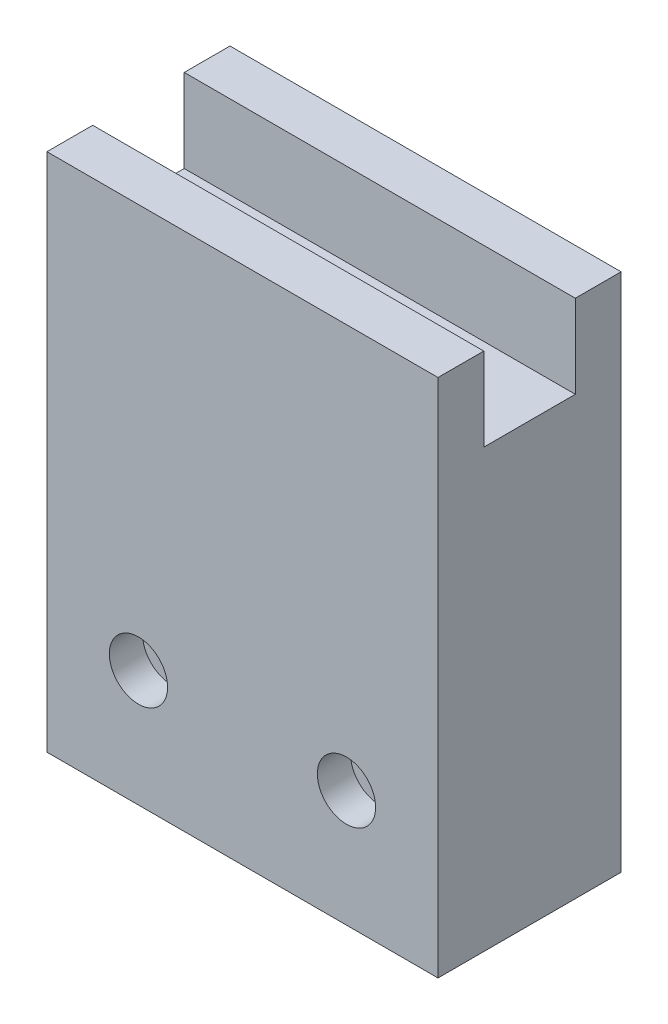
ISO-10303-21;
HEADER;
FILE_DESCRIPTION(('STEP AP214'),'2;1');
FILE_NAME('part.step','',(''),(''),'','','');
FILE_SCHEMA(('AUTOMOTIVE_DESIGN { 1 0 10303 214 1 1 1 1 }'));
ENDSEC;
DATA;
#1=APPLICATION_CONTEXT('core data for automotive mechanical design processes');
#2=APPLICATION_PROTOCOL_DEFINITION('international standard','automotive_design',2000,#1);
#3=PRODUCT_CONTEXT('',#1,'mechanical');
#4=PRODUCT('Part','Part','',(#3));
#5=PRODUCT_RELATED_PRODUCT_CATEGORY('part','',(#4));
#6=PRODUCT_DEFINITION_FORMATION('','',#4);
#7=PRODUCT_DEFINITION_CONTEXT('part definition',#1,'design');
#8=PRODUCT_DEFINITION('design','',#6,#7);
#9=PRODUCT_DEFINITION_SHAPE('','',#8);
#10=(LENGTH_UNIT() NAMED_UNIT(*) SI_UNIT(.MILLI.,.METRE.));
#11=(NAMED_UNIT(*) PLANE_ANGLE_UNIT() SI_UNIT($,.RADIAN.));
#12=(NAMED_UNIT(*) SI_UNIT($,.STERADIAN.) SOLID_ANGLE_UNIT());
#13=UNCERTAINTY_MEASURE_WITH_UNIT(LENGTH_MEASURE(1.E-05),#10,'distance_accuracy_value','');
#14=(GEOMETRIC_REPRESENTATION_CONTEXT(3) GLOBAL_UNCERTAINTY_ASSIGNED_CONTEXT((#13)) GLOBAL_UNIT_ASSIGNED_CONTEXT((#10,
#11,#12)) REPRESENTATION_CONTEXT('',''));
#15=CARTESIAN_POINT('',(0.,0.,0.));
#16=DIRECTION('',(0.,0.,1.));
#17=DIRECTION('',(1.,0.,0.));
#18=AXIS2_PLACEMENT_3D('',#15,#16,#17);
#19=CARTESIAN_POINT('',(0.,0.,22.));
#20=DIRECTION('',(0.,1.,0.));
#21=DIRECTION('',(-1.,0.,0.));
#22=AXIS2_PLACEMENT_3D('',#19,#20,#21);
#23=PLANE('',#22);
#24=CARTESIAN_POINT('',(-36.,0.,11.));
#25=DIRECTION('',(0.,-1.,0.));
#26=DIRECTION('',(1.,0.,0.));
#27=AXIS2_PLACEMENT_3D('',#24,#25,#26);
#28=CIRCLE('',#27,2.5);
#29=CARTESIAN_POINT('',(-33.5,0.,11.));
#30=VERTEX_POINT('',#29);
#31=EDGE_CURVE('E510',#30,#30,#28,.T.);
#32=ORIENTED_EDGE('',*,*,#31,.F.);
#33=EDGE_LOOP('',(#32));
#34=FACE_BOUND('',#33,.T.);
#35=DIRECTION('',(1.,0.,0.));
#36=VECTOR('',#35,1.);
#37=CARTESIAN_POINT('',(0.,0.,0.));
#38=LINE('',#37,#36);
#39=CARTESIAN_POINT('',(-47.,0.,0.));
#40=VERTEX_POINT('',#39);
#41=CARTESIAN_POINT('',(0.,0.,0.));
#42=VERTEX_POINT('',#41);
#43=EDGE_CURVE('E101',#40,#42,#38,.T.);
#44=ORIENTED_EDGE('',*,*,#43,.T.);
#45=DIRECTION('',(0.,0.,-1.));
#46=VECTOR('',#45,1.);
#47=CARTESIAN_POINT('',(0.,0.,22.));
#48=LINE('',#47,#46);
#49=CARTESIAN_POINT('',(0.,0.,22.));
#50=VERTEX_POINT('',#49);
#51=EDGE_CURVE('E195',#50,#42,#48,.T.);
#52=ORIENTED_EDGE('',*,*,#51,.F.);
#53=DIRECTION('',(1.,0.,0.));
#54=VECTOR('',#53,1.);
#55=CARTESIAN_POINT('',(0.,0.,22.));
#56=LINE('',#55,#54);
#57=CARTESIAN_POINT('',(-47.,0.,22.));
#58=VERTEX_POINT('',#57);
#59=EDGE_CURVE('E80',#58,#50,#56,.T.);
#60=ORIENTED_EDGE('',*,*,#59,.F.);
#61=DIRECTION('',(0.,0.,-1.));
#62=VECTOR('',#61,1.);
#63=CARTESIAN_POINT('',(-47.,0.,22.));
#64=LINE('',#63,#62);
#65=EDGE_CURVE('E157',#58,#40,#64,.T.);
#66=ORIENTED_EDGE('',*,*,#65,.T.);
#67=EDGE_LOOP('',(#44,#52,#60,#66));
#68=FACE_BOUND('',#67,.T.);
#69=CARTESIAN_POINT('',(-11.,0.,11.));
#70=DIRECTION('',(0.,-1.,0.));
#71=DIRECTION('',(1.,0.,0.));
#72=AXIS2_PLACEMENT_3D('',#69,#70,#71);
#73=CIRCLE('',#72,2.5);
#74=CARTESIAN_POINT('',(-8.5,0.,11.));
#75=VERTEX_POINT('',#74);
#76=EDGE_CURVE('E357',#75,#75,#73,.F.);
#77=ORIENTED_EDGE('',*,*,#76,.T.);
#78=EDGE_LOOP('',(#77));
#79=FACE_BOUND('',#78,.T.);
#80=ADVANCED_FACE('F49',(#34,#68,#79),#23,.F.);
#81=CARTESIAN_POINT('',(-11.,13.,11.));
#82=DIRECTION('',(0.,-1.,0.));
#83=DIRECTION('',(0.,0.,-1.));
#84=AXIS2_PLACEMENT_3D('',#81,#82,#83);
#85=CYLINDRICAL_SURFACE('',#84,1.5);
#86=CARTESIAN_POINT('',(-11.,12.,9.5));
#87=CARTESIAN_POINT('',(-10.9267792641588,12.0000045980361,9.50000479201202));
#88=CARTESIAN_POINT('',(-10.8534389379785,12.0040635447373,9.5054050243745));
#89=CARTESIAN_POINT('',(-10.7090636037135,12.0199339271892,9.52666706341016));
#90=CARTESIAN_POINT('',(-10.638034863771,12.0317648532015,9.54255517165006));
#91=CARTESIAN_POINT('',(-10.5007653733688,12.0620432504394,9.58371290928377));
#92=CARTESIAN_POINT('',(-10.4344983845963,12.0804504806799,9.60892551356918));
#93=CARTESIAN_POINT('',(-10.3075776644792,12.1224944327831,9.66754234418723));
#94=CARTESIAN_POINT('',(-10.2469222982037,12.1461296246452,9.70094417419352));
#95=CARTESIAN_POINT('',(-10.1265340624099,12.1995045545602,9.77826301159083));
#96=CARTESIAN_POINT('',(-10.067406770728,12.2296069145156,9.82286732933408));
#97=CARTESIAN_POINT('',(-9.95697283232329,12.2923298211662,9.91949583736117));
#98=CARTESIAN_POINT('',(-9.90567851727774,12.3249542192139,9.97153148279983));
#99=CARTESIAN_POINT('',(-9.80162838563377,12.3972887634801,10.0935829532784));
#100=CARTESIAN_POINT('',(-9.75069421578796,12.4370914513536,10.1651036771217));
#101=CARTESIAN_POINT('',(-9.66138001823652,12.5128855533586,10.3174510123665));
#102=CARTESIAN_POINT('',(-9.62298283016923,12.5488821311632,10.3982646970003));
#103=CARTESIAN_POINT('',(-9.57119372188212,12.6002284481982,10.5395028386762));
#104=CARTESIAN_POINT('',(-9.55374325543461,12.6184224881327,10.5973906971284));
#105=CARTESIAN_POINT('',(-9.52579327435156,12.6482840584931,10.7163927347849));
#106=CARTESIAN_POINT('',(-9.51527784644733,12.6599665208917,10.7774991778748));
#107=CARTESIAN_POINT('',(-9.50187177858555,12.6749624031545,10.9021825855308));
#108=CARTESIAN_POINT('',(-9.49905045145793,12.678199733234,10.9657768067241));
#109=CARTESIAN_POINT('',(-9.50151786758131,12.6754046822393,11.0926149108816));
#110=CARTESIAN_POINT('',(-9.50680951842651,12.6693689778189,11.1558586600874));
#111=CARTESIAN_POINT('',(-9.52402260708118,12.6503237673748,11.2731913474258));
#112=CARTESIAN_POINT('',(-9.53517513619183,12.6381284294013,11.3275363710462));
#113=CARTESIAN_POINT('',(-9.56294328879267,12.6088580715506,11.4334388787209));
#114=CARTESIAN_POINT('',(-9.57956416318828,12.5917783635923,11.4849936278236));
#115=CARTESIAN_POINT('',(-9.62966935827465,12.5425823070569,11.6162563866342));
#116=CARTESIAN_POINT('',(-9.6671985150602,12.5077435086077,11.6934004166435));
#117=CARTESIAN_POINT('',(-9.75381976685481,12.434667018548,11.8391965238691));
#118=CARTESIAN_POINT('',(-9.80293995744122,12.3964212111389,11.9078273392547));
#119=CARTESIAN_POINT('',(-9.91348395897865,12.3194832768686,12.0377533904037));
#120=CARTESIAN_POINT('',(-9.97518624473964,12.2808041326976,12.0988206068815));
#121=CARTESIAN_POINT('',(-10.1095774782904,12.2075196201903,12.2102636467812));
#122=CARTESIAN_POINT('',(-10.1822449457062,12.1729065173624,12.2606599202304));
#123=CARTESIAN_POINT('',(-10.3220979195459,12.1172027392636,12.3399807992403));
#124=CARTESIAN_POINT('',(-10.3874601298144,12.0947922905499,12.3711845942158));
#125=CARTESIAN_POINT('',(-10.5236478267979,12.0562709558305,12.4242248804639));
#126=CARTESIAN_POINT('',(-10.5944698589362,12.0401561249565,12.4460672384993));
#127=CARTESIAN_POINT('',(-10.7403237675165,12.0155441136401,12.4792533628864));
#128=CARTESIAN_POINT('',(-10.8153787185941,12.0070940702825,12.4905321789386));
#129=CARTESIAN_POINT('',(-10.9667987602031,11.9988411634056,12.5015495973717));
#130=CARTESIAN_POINT('',(-11.0431632843727,11.9990346515459,12.5012930686954));
#131=CARTESIAN_POINT('',(-11.1868042173296,12.0075745282413,12.4898891307268));
#132=CARTESIAN_POINT('',(-11.2542223275461,12.015099133996,12.4798394631113));
#133=CARTESIAN_POINT('',(-11.3861106706091,12.0364867979841,12.4510262199921));
#134=CARTESIAN_POINT('',(-11.4505802729873,12.0503512049274,12.4322607903106));
#135=CARTESIAN_POINT('',(-11.5774167796898,12.0840016931669,12.3861124694069));
#136=CARTESIAN_POINT('',(-11.6396291725361,12.1039794970981,12.3584488185726));
#137=CARTESIAN_POINT('',(-11.7585185270431,12.1483301458804,12.2958275445744));
#138=CARTESIAN_POINT('',(-11.8151947213364,12.1727035986793,12.2608689123603));
#139=CARTESIAN_POINT('',(-11.931511626319,12.228808531135,12.1782167535894));
#140=CARTESIAN_POINT('',(-11.9900667626987,12.2610890497496,12.1293714605626));
#141=CARTESIAN_POINT('',(-12.0987197485585,12.3276104712522,12.0239912474116));
#142=CARTESIAN_POINT('',(-12.1487983046958,12.3618556149261,11.9674393003066));
#143=CARTESIAN_POINT('',(-12.2487754107563,12.436308717085,11.8358501190388));
#144=CARTESIAN_POINT('',(-12.296830436487,12.476412814799,11.7593424385077));
#145=CARTESIAN_POINT('',(-12.3792323599828,12.5505940865155,11.5966399220276));
#146=CARTESIAN_POINT('',(-12.4136200051552,12.5846890042903,11.5104748780914));
#147=CARTESIAN_POINT('',(-12.4561573425677,12.6288112219142,11.3645855511255));
#148=CARTESIAN_POINT('',(-12.46931009513,12.6430418817544,11.3076088735976));
#149=CARTESIAN_POINT('',(-12.4889152218191,12.6645794389699,11.1912929530168));
#150=CARTESIAN_POINT('',(-12.4953825519924,12.6719017877977,11.1319592931978));
#151=CARTESIAN_POINT('',(-12.5011532020906,12.6784239820779,11.0121709201887));
#152=CARTESIAN_POINT('',(-12.5004201532526,12.6775825931503,10.9517120569904));
#153=CARTESIAN_POINT('',(-12.4917688383822,12.6678355145633,10.8319431612478));
#154=CARTESIAN_POINT('',(-12.4838413002458,12.6589194184252,10.7726347121028));
#155=CARTESIAN_POINT('',(-12.4589384181972,12.6318265120223,10.6440854285892));
#156=CARTESIAN_POINT('',(-12.4403656795411,12.6120529404936,10.5755028198672));
#157=CARTESIAN_POINT('',(-12.3946962726612,12.5661703661459,10.4434651511695));
#158=CARTESIAN_POINT('',(-12.3675780729773,12.5400453985307,10.3800235579618));
#159=CARTESIAN_POINT('',(-12.2949891893364,12.4748352267118,10.2374793695137));
#160=CARTESIAN_POINT('',(-12.2464154206597,12.434397968089,10.1605784172443));
#161=CARTESIAN_POINT('',(-12.1365071846594,12.3528648981873,10.0168739550224));
#162=CARTESIAN_POINT('',(-12.0751613475858,12.3117685304578,9.95007953405516));
#163=CARTESIAN_POINT('',(-11.9396271449379,12.2327101106021,9.82716815771668));
#164=CARTESIAN_POINT('',(-11.8653371615629,12.1947766628893,9.77114368062282));
#165=CARTESIAN_POINT('',(-11.7051590989362,12.126427103319,9.67277694885466));
#166=CARTESIAN_POINT('',(-11.6192994204018,12.0959930840704,9.6304020254275));
#167=CARTESIAN_POINT('',(-11.4648402903565,12.0536329537595,9.5722005790143));
#168=CARTESIAN_POINT('',(-11.3985536147747,12.0388967750028,9.55223326862383));
#169=CARTESIAN_POINT('',(-11.2628416103928,12.0161626002976,9.52158209738851));
#170=CARTESIAN_POINT('',(-11.1934256238349,12.0081457878911,9.51087230975004));
#171=CARTESIAN_POINT('',(-11.1029633098619,12.0025452829369,9.50339530578565));
#172=CARTESIAN_POINT('',(-11.0824069459941,12.0015923856792,9.50212372251059));
#173=CARTESIAN_POINT('',(-11.0412368896244,12.0003190457686,9.50042532676903));
#174=CARTESIAN_POINT('',(-11.0206231884284,11.9999987049275,9.49999865029263));
#175=CARTESIAN_POINT('',(-11.,12.,9.5));
#176=B_SPLINE_CURVE_WITH_KNOTS('',3,(#86,#87,#88,#89,#90,#91,#92,#93,#94,#95,#96,#97,#98,#99,
#100,#101,#102,#103,#104,#105,#106,#107,#108,#109,#110,#111,#112,#113,#114,#115,#116,#117,#118,
#119,#120,#121,#122,#123,#124,#125,#126,#127,#128,#129,#130,#131,#132,#133,#134,#135,#136,#137,
#138,#139,#140,#141,#142,#143,#144,#145,#146,#147,#148,#149,#150,#151,#152,#153,#154,#155,#156,
#157,#158,#159,#160,#161,#162,#163,#164,#165,#166,#167,#168,#169,#170,#171,#172,#173,#174,#175),
.UNSPECIFIED.,.T.,.F.,(4,2,2,2,2,2,2,2,2,2,2,2,2,2,2,2,2,2,2,2,2,2,2,2,2,2,2,2,2,2,2,2,2,2,2,2,
2,2,2,2,2,2,2,2,4),(0.,0.219571786572042,0.439696319423243,0.65849633357338,0.877232398849292,
1.1162243131743,1.35558868405162,1.64360015887451,1.93121574056506,2.11999518529901,
2.3083399319529,2.49837587621257,2.6884799430021,2.85826890162709,3.0282213760064,
3.3044933180591,3.58144192357889,3.8653588393809,4.14872662493691,4.37526505006389,
4.60166129643117,4.82944058166899,5.05712372466613,5.26191187011994,5.46674360185812,
5.67880439483679,5.89089453977541,6.13840382081868,6.38646908985452,6.68168596015947,
6.97601595850112,7.15589161422933,7.33536399114208,7.51574333854741,7.69635548563854,
7.91639670960134,8.13699685139921,8.43412246655767,8.73151372390892,9.03135449492649,
9.33047220273163,9.54195697541629,9.75284752283256,9.81468166878711,9.87652576630966),.UNSPECIFIED.);
#177=CARTESIAN_POINT('',(-11.,12.,9.5));
#178=VERTEX_POINT('',#177);
#179=EDGE_CURVE('E53',#178,#178,#176,.T.);
#180=ORIENTED_EDGE('',*,*,#179,.F.);
#181=EDGE_LOOP('',(#180));
#182=FACE_BOUND('',#181,.T.);
#183=CARTESIAN_POINT('',(-11.,4.,11.));
#184=DIRECTION('',(0.,-1.,0.));
#185=DIRECTION('',(1.,0.,0.));
#186=AXIS2_PLACEMENT_3D('',#183,#184,#185);
#187=CIRCLE('',#186,1.5);
#188=CARTESIAN_POINT('',(-9.5,4.,11.));
#189=VERTEX_POINT('',#188);
#190=EDGE_CURVE('E515',#189,#189,#187,.F.);
#191=ORIENTED_EDGE('',*,*,#190,.F.);
#192=EDGE_LOOP('',(#191));
#193=FACE_BOUND('',#192,.T.);
#194=ADVANCED_FACE('F236',(#182,#193),#85,.F.);
#195=CARTESIAN_POINT('',(-36.,13.,11.));
#196=DIRECTION('',(0.,-1.,0.));
#197=DIRECTION('',(0.,0.,-1.));
#198=AXIS2_PLACEMENT_3D('',#195,#196,#197);
#199=CYLINDRICAL_SURFACE('',#198,1.5);
#200=CARTESIAN_POINT('',(-36.,12.,9.49999999999999));
#201=CARTESIAN_POINT('',(-35.9267792641589,12.000004598036,9.50000479201202));
#202=CARTESIAN_POINT('',(-35.8534389379785,12.0040635447373,9.50540502437449));
#203=CARTESIAN_POINT('',(-35.7090636037135,12.0199339271892,9.52666706341016));
#204=CARTESIAN_POINT('',(-35.638034863771,12.0317648532015,9.54255517165005));
#205=CARTESIAN_POINT('',(-35.5007653733688,12.0620432504394,9.58371290928377));
#206=CARTESIAN_POINT('',(-35.4344983845963,12.0804504806799,9.60892551356917));
#207=CARTESIAN_POINT('',(-35.3075776644792,12.1224944327831,9.66754234418723));
#208=CARTESIAN_POINT('',(-35.2469222982037,12.1461296246452,9.70094417419351));
#209=CARTESIAN_POINT('',(-35.1265340624099,12.1995045545602,9.77826301159082));
#210=CARTESIAN_POINT('',(-35.067406770728,12.2296069145156,9.82286732933407));
#211=CARTESIAN_POINT('',(-34.9569728323233,12.2923298211662,9.91949583736117));
#212=CARTESIAN_POINT('',(-34.9056785172777,12.3249542192139,9.97153148279983));
#213=CARTESIAN_POINT('',(-34.8016283856338,12.3972887634801,10.0935829532784));
#214=CARTESIAN_POINT('',(-34.750694215788,12.4370914513536,10.1651036771217));
#215=CARTESIAN_POINT('',(-34.6613800182365,12.5128855533586,10.3174510123665));
#216=CARTESIAN_POINT('',(-34.6229828301692,12.5488821311632,10.3982646970003));
#217=CARTESIAN_POINT('',(-34.5711937218821,12.6002284481982,10.5395028386762));
#218=CARTESIAN_POINT('',(-34.5537432554346,12.6184224881327,10.5973906971284));
#219=CARTESIAN_POINT('',(-34.5257932743516,12.6482840584931,10.7163927347849));
#220=CARTESIAN_POINT('',(-34.5152778464473,12.6599665208917,10.7774991778748));
#221=CARTESIAN_POINT('',(-34.5018717785855,12.6749624031545,10.9021825855308));
#222=CARTESIAN_POINT('',(-34.4990504514579,12.678199733234,10.9657768067241));
#223=CARTESIAN_POINT('',(-34.5015178675813,12.6754046822393,11.0926149108816));
#224=CARTESIAN_POINT('',(-34.5068095184265,12.6693689778189,11.1558586600874));
#225=CARTESIAN_POINT('',(-34.5240226070812,12.6503237673748,11.2731913474258));
#226=CARTESIAN_POINT('',(-34.5351751361918,12.6381284294013,11.3275363710462));
#227=CARTESIAN_POINT('',(-34.5629432887927,12.6088580715506,11.4334388787209));
#228=CARTESIAN_POINT('',(-34.5795641631883,12.5917783635923,11.4849936278236));
#229=CARTESIAN_POINT('',(-34.6296693582747,12.5425823070569,11.6162563866342));
#230=CARTESIAN_POINT('',(-34.6671985150602,12.5077435086077,11.6934004166435));
#231=CARTESIAN_POINT('',(-34.7538197668548,12.434667018548,11.8391965238691));
#232=CARTESIAN_POINT('',(-34.8029399574412,12.3964212111389,11.9078273392547));
#233=CARTESIAN_POINT('',(-34.9134839589787,12.3194832768685,12.0377533904037));
#234=CARTESIAN_POINT('',(-34.9751862447396,12.2808041326976,12.0988206068815));
#235=CARTESIAN_POINT('',(-35.1095774782904,12.2075196201903,12.2102636467812));
#236=CARTESIAN_POINT('',(-35.1822449457063,12.1729065173624,12.2606599202304));
#237=CARTESIAN_POINT('',(-35.3220979195459,12.1172027392636,12.3399807992403));
#238=CARTESIAN_POINT('',(-35.3874601298144,12.0947922905499,12.3711845942158));
#239=CARTESIAN_POINT('',(-35.5236478267979,12.0562709558305,12.4242248804639));
#240=CARTESIAN_POINT('',(-35.5944698589362,12.0401561249565,12.4460672384993));
#241=CARTESIAN_POINT('',(-35.7403237675165,12.0155441136401,12.4792533628864));
#242=CARTESIAN_POINT('',(-35.8153787185941,12.0070940702825,12.4905321789386));
#243=CARTESIAN_POINT('',(-35.9667987602031,11.9988411634056,12.5015495973717));
#244=CARTESIAN_POINT('',(-36.0431632843727,11.9990346515459,12.5012930686954));
#245=CARTESIAN_POINT('',(-36.1868042173296,12.0075745282413,12.4898891307268));
#246=CARTESIAN_POINT('',(-36.2542223275461,12.015099133996,12.4798394631113));
#247=CARTESIAN_POINT('',(-36.3861106706091,12.0364867979841,12.4510262199921));
#248=CARTESIAN_POINT('',(-36.4505802729873,12.0503512049274,12.4322607903106));
#249=CARTESIAN_POINT('',(-36.5774167796898,12.0840016931669,12.3861124694069));
#250=CARTESIAN_POINT('',(-36.6396291725361,12.1039794970981,12.3584488185726));
#251=CARTESIAN_POINT('',(-36.7585185270431,12.1483301458804,12.2958275445744));
#252=CARTESIAN_POINT('',(-36.8151947213364,12.1727035986793,12.2608689123603));
#253=CARTESIAN_POINT('',(-36.931511626319,12.228808531135,12.1782167535894));
#254=CARTESIAN_POINT('',(-36.9900667626987,12.2610890497496,12.1293714605625));
#255=CARTESIAN_POINT('',(-37.0987197485586,12.3276104712522,12.0239912474116));
#256=CARTESIAN_POINT('',(-37.1487983046958,12.3618556149261,11.9674393003066));
#257=CARTESIAN_POINT('',(-37.2487754107563,12.436308717085,11.8358501190388));
#258=CARTESIAN_POINT('',(-37.2968304364871,12.476412814799,11.7593424385077));
#259=CARTESIAN_POINT('',(-37.3792323599828,12.5505940865155,11.5966399220275));
#260=CARTESIAN_POINT('',(-37.4136200051552,12.5846890042903,11.5104748780914));
#261=CARTESIAN_POINT('',(-37.4561573425677,12.6288112219142,11.3645855511255));
#262=CARTESIAN_POINT('',(-37.46931009513,12.6430418817544,11.3076088735976));
#263=CARTESIAN_POINT('',(-37.4889152218191,12.6645794389699,11.1912929530168));
#264=CARTESIAN_POINT('',(-37.4953825519924,12.6719017877977,11.1319592931977));
#265=CARTESIAN_POINT('',(-37.5011532020906,12.6784239820779,11.0121709201887));
#266=CARTESIAN_POINT('',(-37.5004201532526,12.6775825931503,10.9517120569904));
#267=CARTESIAN_POINT('',(-37.4917688383822,12.6678355145633,10.8319431612478));
#268=CARTESIAN_POINT('',(-37.4838413002458,12.6589194184252,10.7726347121027));
#269=CARTESIAN_POINT('',(-37.4589384181972,12.6318265120223,10.6440854285892));
#270=CARTESIAN_POINT('',(-37.4403656795411,12.6120529404936,10.5755028198672));
#271=CARTESIAN_POINT('',(-37.3946962726612,12.5661703661459,10.4434651511695));
#272=CARTESIAN_POINT('',(-37.3675780729773,12.5400453985307,10.3800235579618));
#273=CARTESIAN_POINT('',(-37.2949891893364,12.4748352267118,10.2374793695137));
#274=CARTESIAN_POINT('',(-37.2464154206597,12.434397968089,10.1605784172442));
#275=CARTESIAN_POINT('',(-37.1365071846594,12.3528648981873,10.0168739550224));
#276=CARTESIAN_POINT('',(-37.0751613475858,12.3117685304578,9.95007953405514));
#277=CARTESIAN_POINT('',(-36.9396271449379,12.2327101106021,9.82716815771666));
#278=CARTESIAN_POINT('',(-36.8653371615629,12.1947766628893,9.7711436806228));
#279=CARTESIAN_POINT('',(-36.7051590989362,12.126427103319,9.67277694885464));
#280=CARTESIAN_POINT('',(-36.6192994204018,12.0959930840704,9.63040202542749));
#281=CARTESIAN_POINT('',(-36.4648402903564,12.0536329537595,9.57220057901429));
#282=CARTESIAN_POINT('',(-36.3985536147747,12.0388967750028,9.55223326862382));
#283=CARTESIAN_POINT('',(-36.2628416103927,12.0161626002976,9.5215820973885));
#284=CARTESIAN_POINT('',(-36.1934256238349,12.0081457878911,9.51087230975003));
#285=CARTESIAN_POINT('',(-36.1029633098619,12.0025452829369,9.50339530578565));
#286=CARTESIAN_POINT('',(-36.0824069459941,12.0015923856792,9.50212372251058));
#287=CARTESIAN_POINT('',(-36.0412368896244,12.0003190457686,9.50042532676902));
#288=CARTESIAN_POINT('',(-36.0206231884284,11.9999987049275,9.49999865029262));
#289=CARTESIAN_POINT('',(-36.,12.,9.49999999999999));
#290=B_SPLINE_CURVE_WITH_KNOTS('',3,(#200,#201,#202,#203,#204,#205,#206,#207,#208,#209,#210,
#211,#212,#213,#214,#215,#216,#217,#218,#219,#220,#221,#222,#223,#224,#225,#226,#227,#228,#229,
#230,#231,#232,#233,#234,#235,#236,#237,#238,#239,#240,#241,#242,#243,#244,#245,#246,#247,#248,
#249,#250,#251,#252,#253,#254,#255,#256,#257,#258,#259,#260,#261,#262,#263,#264,#265,#266,#267,
#268,#269,#270,#271,#272,#273,#274,#275,#276,#277,#278,#279,#280,#281,#282,#283,#284,#285,#286,
#287,#288,#289),.UNSPECIFIED.,.T.,.F.,(4,2,2,2,2,2,2,2,2,2,2,2,2,2,2,2,2,2,2,2,2,2,2,2,2,2,2,2,
2,2,2,2,2,2,2,2,2,2,2,2,2,2,2,2,4),(0.,0.219571786572042,0.439696319423247,0.658496333573389,
0.877232398849301,1.1162243131743,1.35558868405162,1.64360015887451,1.93121574056507,
2.11999518529902,2.30833993195291,2.49837587621258,2.68847994300211,2.8582689016271,
3.02822137600641,3.30449331805911,3.58144192357891,3.86535883938092,4.14872662493692,
4.37526505006391,4.60166129643119,4.829440581669,5.05712372466615,5.26191187011996,
5.46674360185814,5.67880439483681,5.89089453977543,6.1384038208187,6.38646908985455,
6.6816859601595,6.97601595850116,7.15589161422936,7.33536399114211,7.51574333854744,
7.69635548563857,7.91639670960137,8.13699685139924,8.43412246655771,8.73151372390896,
9.03135449492654,9.33047220273168,9.54195697541634,9.7528475228326,9.81468166878715,
9.87652576630969),.UNSPECIFIED.);
#291=CARTESIAN_POINT('',(-36.,12.,9.49999999999999));
#292=VERTEX_POINT('',#291);
#293=EDGE_CURVE('E349',#292,#292,#290,.T.);
#294=ORIENTED_EDGE('',*,*,#293,.F.);
#295=EDGE_LOOP('',(#294));
#296=FACE_BOUND('',#295,.T.);
#297=CARTESIAN_POINT('',(-36.,4.,11.));
#298=DIRECTION('',(0.,-1.,0.));
#299=DIRECTION('',(1.,0.,0.));
#300=AXIS2_PLACEMENT_3D('',#297,#298,#299);
#301=CIRCLE('',#300,1.5);
#302=CARTESIAN_POINT('',(-34.5,4.,11.));
#303=VERTEX_POINT('',#302);
#304=EDGE_CURVE('E505',#303,#303,#301,.T.);
#305=ORIENTED_EDGE('',*,*,#304,.T.);
#306=EDGE_LOOP('',(#305));
#307=FACE_BOUND('',#306,.T.);
#308=ADVANCED_FACE('F232',(#296,#307),#199,.F.);
#309=CARTESIAN_POINT('',(-11.,14.,0.));
#310=DIRECTION('',(0.,0.,1.));
#311=DIRECTION('',(1.,0.,0.));
#312=AXIS2_PLACEMENT_3D('',#309,#310,#311);
#313=CYLINDRICAL_SURFACE('',#312,2.);
#314=CARTESIAN_POINT('',(-11.,14.,0.));
#315=DIRECTION('',(0.,0.,1.));
#316=DIRECTION('',(1.,0.,0.));
#317=AXIS2_PLACEMENT_3D('',#314,#315,#316);
#318=CIRCLE('',#317,2.);
#319=CARTESIAN_POINT('',(-8.99999999999999,14.,0.));
#320=VERTEX_POINT('',#319);
#321=EDGE_CURVE('E167',#320,#320,#318,.F.);
#322=ORIENTED_EDGE('',*,*,#321,.T.);
#323=EDGE_LOOP('',(#322));
#324=FACE_BOUND('',#323,.T.);
#325=CARTESIAN_POINT('',(-11.,14.,18.));
#326=DIRECTION('',(0.,0.,1.));
#327=DIRECTION('',(-1.,0.,0.));
#328=AXIS2_PLACEMENT_3D('',#325,#326,#327);
#329=CIRCLE('',#328,2.);
#330=CARTESIAN_POINT('',(-13.,14.,18.));
#331=VERTEX_POINT('',#330);
#332=EDGE_CURVE('E356',#331,#331,#329,.T.);
#333=ORIENTED_EDGE('',*,*,#332,.T.);
#334=EDGE_LOOP('',(#333));
#335=FACE_BOUND('',#334,.T.);
#336=ORIENTED_EDGE('',*,*,#179,.T.);
#337=EDGE_LOOP('',(#336));
#338=FACE_BOUND('',#337,.T.);
#339=ADVANCED_FACE('F223',(#324,#335,#338),#313,.F.);
#340=CARTESIAN_POINT('',(0.,0.,22.));
#341=DIRECTION('',(0.,0.,1.));
#342=DIRECTION('',(1.,0.,0.));
#343=AXIS2_PLACEMENT_3D('',#340,#341,#342);
#344=PLANE('',#343);
#345=CARTESIAN_POINT('',(-11.,14.,22.));
#346=DIRECTION('',(0.,0.,1.));
#347=DIRECTION('',(1.,0.,0.));
#348=AXIS2_PLACEMENT_3D('',#345,#346,#347);
#349=CIRCLE('',#348,3.5);
#350=CARTESIAN_POINT('',(-14.5,14.,22.));
#351=VERTEX_POINT('',#350);
#352=EDGE_CURVE('E162',#351,#351,#349,.F.);
#353=ORIENTED_EDGE('',*,*,#352,.T.);
#354=EDGE_LOOP('',(#353));
#355=FACE_BOUND('',#354,.T.);
#356=DIRECTION('',(0.,1.,0.));
#357=VECTOR('',#356,1.);
#358=CARTESIAN_POINT('',(0.,0.,22.));
#359=LINE('',#358,#357);
#360=CARTESIAN_POINT('',(0.,62.5,22.));
#361=VERTEX_POINT('',#360);
#362=EDGE_CURVE('E190',#50,#361,#359,.T.);
#363=ORIENTED_EDGE('',*,*,#362,.T.);
#364=DIRECTION('',(-1.,0.,0.));
#365=VECTOR('',#364,1.);
#366=CARTESIAN_POINT('',(0.,62.5,22.));
#367=LINE('',#366,#365);
#368=CARTESIAN_POINT('',(-47.,62.5,22.));
#369=VERTEX_POINT('',#368);
#370=EDGE_CURVE('E109',#361,#369,#367,.T.);
#371=ORIENTED_EDGE('',*,*,#370,.T.);
#372=DIRECTION('',(0.,-1.,0.));
#373=VECTOR('',#372,1.);
#374=CARTESIAN_POINT('',(-47.,0.,22.));
#375=LINE('',#374,#373);
#376=EDGE_CURVE('E152',#369,#58,#375,.T.);
#377=ORIENTED_EDGE('',*,*,#376,.T.);
#378=ORIENTED_EDGE('',*,*,#59,.T.);
#379=EDGE_LOOP('',(#363,#371,#377,#378));
#380=FACE_BOUND('',#379,.T.);
#381=CARTESIAN_POINT('',(-36.,14.,22.));
#382=DIRECTION('',(0.,0.,1.));
#383=DIRECTION('',(1.,0.,0.));
#384=AXIS2_PLACEMENT_3D('',#381,#382,#383);
#385=CIRCLE('',#384,3.5);
#386=CARTESIAN_POINT('',(-39.5,14.,22.));
#387=VERTEX_POINT('',#386);
#388=EDGE_CURVE('E164',#387,#387,#385,.F.);
#389=ORIENTED_EDGE('',*,*,#388,.T.);
#390=EDGE_LOOP('',(#389));
#391=FACE_BOUND('',#390,.T.);
#392=ADVANCED_FACE('F220',(#355,#380,#391),#344,.T.);
#393=CARTESIAN_POINT('',(-36.,14.,0.));
#394=DIRECTION('',(0.,0.,1.));
#395=DIRECTION('',(1.,0.,0.));
#396=AXIS2_PLACEMENT_3D('',#393,#394,#395);
#397=CYLINDRICAL_SURFACE('',#396,2.);
#398=ORIENTED_EDGE('',*,*,#293,.T.);
#399=EDGE_LOOP('',(#398));
#400=FACE_BOUND('',#399,.T.);
#401=CARTESIAN_POINT('',(-36.,14.,0.));
#402=DIRECTION('',(0.,0.,1.));
#403=DIRECTION('',(1.,0.,0.));
#404=AXIS2_PLACEMENT_3D('',#401,#402,#403);
#405=CIRCLE('',#404,2.);
#406=CARTESIAN_POINT('',(-34.,14.,0.));
#407=VERTEX_POINT('',#406);
#408=EDGE_CURVE('E148',#407,#407,#405,.T.);
#409=ORIENTED_EDGE('',*,*,#408,.F.);
#410=EDGE_LOOP('',(#409));
#411=FACE_BOUND('',#410,.T.);
#412=CARTESIAN_POINT('',(-36.,14.,18.));
#413=DIRECTION('',(0.,0.,1.));
#414=DIRECTION('',(1.,0.,0.));
#415=AXIS2_PLACEMENT_3D('',#412,#413,#414);
#416=CIRCLE('',#415,2.);
#417=CARTESIAN_POINT('',(-34.,14.,18.));
#418=VERTEX_POINT('',#417);
#419=EDGE_CURVE('E359',#418,#418,#416,.T.);
#420=ORIENTED_EDGE('',*,*,#419,.T.);
#421=EDGE_LOOP('',(#420));
#422=FACE_BOUND('',#421,.T.);
#423=ADVANCED_FACE('F222',(#400,#411,#422),#397,.F.);
#424=CARTESIAN_POINT('',(0.,0.,0.));
#425=DIRECTION('',(0.,0.,1.));
#426=DIRECTION('',(1.,0.,0.));
#427=AXIS2_PLACEMENT_3D('',#424,#425,#426);
#428=PLANE('',#427);
#429=DIRECTION('',(0.,1.,0.));
#430=VECTOR('',#429,1.);
#431=CARTESIAN_POINT('',(0.,0.,0.));
#432=LINE('',#431,#430);
#433=CARTESIAN_POINT('',(0.,62.5,0.));
#434=VERTEX_POINT('',#433);
#435=EDGE_CURVE('E189',#42,#434,#432,.T.);
#436=ORIENTED_EDGE('',*,*,#435,.F.);
#437=ORIENTED_EDGE('',*,*,#43,.F.);
#438=DIRECTION('',(0.,-1.,0.));
#439=VECTOR('',#438,1.);
#440=CARTESIAN_POINT('',(-47.,0.,0.));
#441=LINE('',#440,#439);
#442=CARTESIAN_POINT('',(-47.,62.5,0.));
#443=VERTEX_POINT('',#442);
#444=EDGE_CURVE('E201',#443,#40,#441,.T.);
#445=ORIENTED_EDGE('',*,*,#444,.F.);
#446=DIRECTION('',(-1.,0.,0.));
#447=VECTOR('',#446,1.);
#448=CARTESIAN_POINT('',(0.,62.5,0.));
#449=LINE('',#448,#447);
#450=EDGE_CURVE('E198',#434,#443,#449,.T.);
#451=ORIENTED_EDGE('',*,*,#450,.F.);
#452=EDGE_LOOP('',(#436,#437,#445,#451));
#453=FACE_BOUND('',#452,.T.);
#454=ORIENTED_EDGE('',*,*,#321,.F.);
#455=EDGE_LOOP('',(#454));
#456=FACE_BOUND('',#455,.T.);
#457=ORIENTED_EDGE('',*,*,#408,.T.);
#458=EDGE_LOOP('',(#457));
#459=FACE_BOUND('',#458,.T.);
#460=ADVANCED_FACE('F209',(#453,#456,#459),#428,.F.);
#461=CARTESIAN_POINT('',(0.,62.5,22.));
#462=DIRECTION('',(0.,-1.,0.));
#463=DIRECTION('',(1.,0.,0.));
#464=AXIS2_PLACEMENT_3D('',#461,#462,#463);
#465=PLANE('',#464);
#466=DIRECTION('',(0.,0.,-1.));
#467=VECTOR('',#466,1.);
#468=CARTESIAN_POINT('',(-47.,62.5,22.));
#469=LINE('',#468,#467);
#470=CARTESIAN_POINT('',(-47.,62.5,5.5));
#471=VERTEX_POINT('',#470);
#472=EDGE_CURVE('E154',#471,#443,#469,.T.);
#473=ORIENTED_EDGE('',*,*,#472,.F.);
#474=DIRECTION('',(-1.,0.,0.));
#475=VECTOR('',#474,1.);
#476=CARTESIAN_POINT('',(-53.5,62.5,5.5));
#477=LINE('',#476,#475);
#478=CARTESIAN_POINT('',(0.,62.5,5.5));
#479=VERTEX_POINT('',#478);
#480=EDGE_CURVE('E147',#479,#471,#477,.T.);
#481=ORIENTED_EDGE('',*,*,#480,.F.);
#482=DIRECTION('',(0.,0.,-1.));
#483=VECTOR('',#482,1.);
#484=CARTESIAN_POINT('',(0.,62.5,22.));
#485=LINE('',#484,#483);
#486=EDGE_CURVE('E153',#479,#434,#485,.T.);
#487=ORIENTED_EDGE('',*,*,#486,.T.);
#488=ORIENTED_EDGE('',*,*,#450,.T.);
#489=EDGE_LOOP('',(#473,#481,#487,#488));
#490=FACE_BOUND('',#489,.T.);
#491=ADVANCED_FACE('F216',(#490),#465,.F.);
#492=CARTESIAN_POINT('',(0.,0.,22.));
#493=DIRECTION('',(-1.,0.,0.));
#494=DIRECTION('',(0.,0.,1.));
#495=AXIS2_PLACEMENT_3D('',#492,#493,#494);
#496=PLANE('',#495);
#497=ORIENTED_EDGE('',*,*,#486,.F.);
#498=DIRECTION('',(0.,-1.,0.));
#499=VECTOR('',#498,1.);
#500=CARTESIAN_POINT('',(0.,0.,5.5));
#501=LINE('',#500,#499);
#502=CARTESIAN_POINT('',(0.,52.5,5.5));
#503=VERTEX_POINT('',#502);
#504=EDGE_CURVE('E186',#479,#503,#501,.T.);
#505=ORIENTED_EDGE('',*,*,#504,.T.);
#506=DIRECTION('',(0.,0.,1.));
#507=VECTOR('',#506,1.);
#508=CARTESIAN_POINT('',(0.,52.5,22.));
#509=LINE('',#508,#507);
#510=CARTESIAN_POINT('',(0.,52.5,16.5));
#511=VERTEX_POINT('',#510);
#512=EDGE_CURVE('E179',#503,#511,#509,.T.);
#513=ORIENTED_EDGE('',*,*,#512,.T.);
#514=DIRECTION('',(0.,1.,0.));
#515=VECTOR('',#514,1.);
#516=CARTESIAN_POINT('',(0.,0.,16.5));
#517=LINE('',#516,#515);
#518=CARTESIAN_POINT('',(0.,62.5,16.5));
#519=VERTEX_POINT('',#518);
#520=EDGE_CURVE('E184',#511,#519,#517,.T.);
#521=ORIENTED_EDGE('',*,*,#520,.T.);
#522=EDGE_CURVE('E146',#361,#519,#485,.T.);
#523=ORIENTED_EDGE('',*,*,#522,.F.);
#524=ORIENTED_EDGE('',*,*,#362,.F.);
#525=ORIENTED_EDGE('',*,*,#51,.T.);
#526=ORIENTED_EDGE('',*,*,#435,.T.);
#527=EDGE_LOOP('',(#497,#505,#513,#521,#523,#524,#525,#526));
#528=FACE_BOUND('',#527,.T.);
#529=ADVANCED_FACE('F51',(#528),#496,.F.);
#530=ORIENTED_EDGE('',*,*,#522,.T.);
#531=DIRECTION('',(1.,0.,0.));
#532=VECTOR('',#531,1.);
#533=CARTESIAN_POINT('',(-53.5,62.5,16.5));
#534=LINE('',#533,#532);
#535=CARTESIAN_POINT('',(-47.,62.5,16.5));
#536=VERTEX_POINT('',#535);
#537=EDGE_CURVE('E133',#536,#519,#534,.T.);
#538=ORIENTED_EDGE('',*,*,#537,.F.);
#539=EDGE_CURVE('E143',#369,#536,#469,.T.);
#540=ORIENTED_EDGE('',*,*,#539,.F.);
#541=ORIENTED_EDGE('',*,*,#370,.F.);
#542=EDGE_LOOP('',(#530,#538,#540,#541));
#543=FACE_BOUND('',#542,.T.);
#544=ADVANCED_FACE('F142',(#543),#465,.F.);
#545=CARTESIAN_POINT('',(-47.,0.,22.));
#546=DIRECTION('',(1.,0.,0.));
#547=DIRECTION('',(0.,0.,-1.));
#548=AXIS2_PLACEMENT_3D('',#545,#546,#547);
#549=PLANE('',#548);
#550=DIRECTION('',(0.,0.,-1.));
#551=VECTOR('',#550,1.);
#552=CARTESIAN_POINT('',(-47.,52.5,22.));
#553=LINE('',#552,#551);
#554=CARTESIAN_POINT('',(-47.,52.5,16.5));
#555=VERTEX_POINT('',#554);
#556=CARTESIAN_POINT('',(-47.,52.5,5.5));
#557=VERTEX_POINT('',#556);
#558=EDGE_CURVE('E140',#555,#557,#553,.T.);
#559=ORIENTED_EDGE('',*,*,#558,.T.);
#560=DIRECTION('',(0.,1.,0.));
#561=VECTOR('',#560,1.);
#562=CARTESIAN_POINT('',(-47.,0.,5.5));
#563=LINE('',#562,#561);
#564=EDGE_CURVE('E12',#557,#471,#563,.T.);
#565=ORIENTED_EDGE('',*,*,#564,.T.);
#566=ORIENTED_EDGE('',*,*,#472,.T.);
#567=ORIENTED_EDGE('',*,*,#444,.T.);
#568=ORIENTED_EDGE('',*,*,#65,.F.);
#569=ORIENTED_EDGE('',*,*,#376,.F.);
#570=ORIENTED_EDGE('',*,*,#539,.T.);
#571=DIRECTION('',(0.,-1.,0.));
#572=VECTOR('',#571,1.);
#573=CARTESIAN_POINT('',(-47.,0.,16.5));
#574=LINE('',#573,#572);
#575=EDGE_CURVE('E63',#536,#555,#574,.T.);
#576=ORIENTED_EDGE('',*,*,#575,.T.);
#577=EDGE_LOOP('',(#559,#565,#566,#567,#568,#569,#570,#576));
#578=FACE_BOUND('',#577,.T.);
#579=ADVANCED_FACE('F150',(#578),#549,.F.);
#580=CARTESIAN_POINT('',(-53.5,52.5,5.5));
#581=DIRECTION('',(0.,0.,-1.));
#582=DIRECTION('',(-1.,0.,0.));
#583=AXIS2_PLACEMENT_3D('',#580,#581,#582);
#584=PLANE('',#583);
#585=ORIENTED_EDGE('',*,*,#480,.T.);
#586=ORIENTED_EDGE('',*,*,#564,.F.);
#587=DIRECTION('',(-1.,0.,0.));
#588=VECTOR('',#587,1.);
#589=CARTESIAN_POINT('',(-53.5,52.5,5.5));
#590=LINE('',#589,#588);
#591=EDGE_CURVE('E71',#503,#557,#590,.T.);
#592=ORIENTED_EDGE('',*,*,#591,.F.);
#593=ORIENTED_EDGE('',*,*,#504,.F.);
#594=EDGE_LOOP('',(#585,#586,#592,#593));
#595=FACE_BOUND('',#594,.T.);
#596=ADVANCED_FACE('F218',(#595),#584,.F.);
#597=CARTESIAN_POINT('',(-53.5,52.5,16.5));
#598=DIRECTION('',(0.,0.,1.));
#599=DIRECTION('',(1.,0.,0.));
#600=AXIS2_PLACEMENT_3D('',#597,#598,#599);
#601=PLANE('',#600);
#602=DIRECTION('',(1.,0.,0.));
#603=VECTOR('',#602,1.);
#604=CARTESIAN_POINT('',(-53.5,52.5,16.5));
#605=LINE('',#604,#603);
#606=EDGE_CURVE('E136',#555,#511,#605,.T.);
#607=ORIENTED_EDGE('',*,*,#606,.F.);
#608=ORIENTED_EDGE('',*,*,#575,.F.);
#609=ORIENTED_EDGE('',*,*,#537,.T.);
#610=ORIENTED_EDGE('',*,*,#520,.F.);
#611=EDGE_LOOP('',(#607,#608,#609,#610));
#612=FACE_BOUND('',#611,.T.);
#613=ADVANCED_FACE('F132',(#612),#601,.F.);
#614=CARTESIAN_POINT('',(0.,52.5,0.));
#615=DIRECTION('',(0.,-1.,0.));
#616=DIRECTION('',(1.,0.,0.));
#617=AXIS2_PLACEMENT_3D('',#614,#615,#616);
#618=PLANE('',#617);
#619=ORIENTED_EDGE('',*,*,#591,.T.);
#620=ORIENTED_EDGE('',*,*,#558,.F.);
#621=ORIENTED_EDGE('',*,*,#606,.T.);
#622=ORIENTED_EDGE('',*,*,#512,.F.);
#623=EDGE_LOOP('',(#619,#620,#621,#622));
#624=FACE_BOUND('',#623,.T.);
#625=ADVANCED_FACE('F219',(#624),#618,.F.);
#626=CARTESIAN_POINT('',(-36.,14.,22.000012));
#627=DIRECTION('',(0.,0.,-1.));
#628=DIRECTION('',(-1.,0.,0.));
#629=AXIS2_PLACEMENT_3D('',#626,#627,#628);
#630=CYLINDRICAL_SURFACE('',#629,3.5);
#631=CARTESIAN_POINT('',(-36.,14.,18.));
#632=DIRECTION('',(0.,0.,1.));
#633=DIRECTION('',(1.,0.,0.));
#634=AXIS2_PLACEMENT_3D('',#631,#632,#633);
#635=CIRCLE('',#634,3.5);
#636=CARTESIAN_POINT('',(-39.5,14.,18.));
#637=VERTEX_POINT('',#636);
#638=EDGE_CURVE('E165',#637,#637,#635,.T.);
#639=CARTESIAN_POINT('',(-39.5,14.,22.));
#640=CARTESIAN_POINT('',(-39.5,14.,21.9583333333333));
#641=CARTESIAN_POINT('',(-39.5,14.,21.9166666666667));
#642=CARTESIAN_POINT('',(-39.5,14.,21.8333333333333));
#643=CARTESIAN_POINT('',(-39.5,14.,21.7916666666667));
#644=CARTESIAN_POINT('',(-39.5,14.,21.7083333333333));
#645=CARTESIAN_POINT('',(-39.5,14.,21.6666666666667));
#646=CARTESIAN_POINT('',(-39.5,14.,21.5833333333333));
#647=CARTESIAN_POINT('',(-39.5,14.,21.5416666666667));
#648=CARTESIAN_POINT('',(-39.5,14.,21.4583333333333));
#649=CARTESIAN_POINT('',(-39.5,14.,21.4166666666667));
#650=CARTESIAN_POINT('',(-39.5,14.,21.3333333333333));
#651=CARTESIAN_POINT('',(-39.5,14.,21.2916666666667));
#652=CARTESIAN_POINT('',(-39.5,14.,21.2083333333333));
#653=CARTESIAN_POINT('',(-39.5,14.,21.1666666666667));
#654=CARTESIAN_POINT('',(-39.5,14.,21.0833333333333));
#655=CARTESIAN_POINT('',(-39.5,14.,21.0416666666667));
#656=CARTESIAN_POINT('',(-39.5,14.,20.9583333333333));
#657=CARTESIAN_POINT('',(-39.5,14.,20.9166666666667));
#658=CARTESIAN_POINT('',(-39.5,14.,20.8333333333333));
#659=CARTESIAN_POINT('',(-39.5,14.,20.7916666666667));
#660=CARTESIAN_POINT('',(-39.5,14.,20.7083333333333));
#661=CARTESIAN_POINT('',(-39.5,14.,20.6666666666667));
#662=CARTESIAN_POINT('',(-39.5,14.,20.5833333333333));
#663=CARTESIAN_POINT('',(-39.5,14.,20.5416666666667));
#664=CARTESIAN_POINT('',(-39.5,14.,20.4583333333333));
#665=CARTESIAN_POINT('',(-39.5,14.,20.4166666666667));
#666=CARTESIAN_POINT('',(-39.5,14.,20.3333333333333));
#667=CARTESIAN_POINT('',(-39.5,14.,20.2916666666667));
#668=CARTESIAN_POINT('',(-39.5,14.,20.2083333333333));
#669=CARTESIAN_POINT('',(-39.5,14.,20.1666666666667));
#670=CARTESIAN_POINT('',(-39.5,14.,20.0833333333333));
#671=CARTESIAN_POINT('',(-39.5,14.,20.0416666666667));
#672=CARTESIAN_POINT('',(-39.5,14.,19.9583333333333));
#673=CARTESIAN_POINT('',(-39.5,14.,19.9166666666667));
#674=CARTESIAN_POINT('',(-39.5,14.,19.8333333333333));
#675=CARTESIAN_POINT('',(-39.5,14.,19.7916666666667));
#676=CARTESIAN_POINT('',(-39.5,14.,19.7083333333333));
#677=CARTESIAN_POINT('',(-39.5,14.,19.6666666666667));
#678=CARTESIAN_POINT('',(-39.5,14.,19.5833333333333));
#679=CARTESIAN_POINT('',(-39.5,14.,19.5416666666667));
#680=CARTESIAN_POINT('',(-39.5,14.,19.4583333333333));
#681=CARTESIAN_POINT('',(-39.5,14.,19.4166666666667));
#682=CARTESIAN_POINT('',(-39.5,14.,19.3333333333333));
#683=CARTESIAN_POINT('',(-39.5,14.,19.2916666666667));
#684=CARTESIAN_POINT('',(-39.5,14.,19.2083333333333));
#685=CARTESIAN_POINT('',(-39.5,14.,19.1666666666667));
#686=CARTESIAN_POINT('',(-39.5,14.,19.0833333333333));
#687=CARTESIAN_POINT('',(-39.5,14.,19.0416666666667));
#688=CARTESIAN_POINT('',(-39.5,14.,18.9583333333333));
#689=CARTESIAN_POINT('',(-39.5,14.,18.9166666666667));
#690=CARTESIAN_POINT('',(-39.5,14.,18.8333333333333));
#691=CARTESIAN_POINT('',(-39.5,14.,18.7916666666667));
#692=CARTESIAN_POINT('',(-39.5,14.,18.7083333333333));
#693=CARTESIAN_POINT('',(-39.5,14.,18.6666666666667));
#694=CARTESIAN_POINT('',(-39.5,14.,18.5833333333333));
#695=CARTESIAN_POINT('',(-39.5,14.,18.5416666666667));
#696=CARTESIAN_POINT('',(-39.5,14.,18.4583333333333));
#697=CARTESIAN_POINT('',(-39.5,14.,18.4166666666667));
#698=CARTESIAN_POINT('',(-39.5,14.,18.3333333333333));
#699=CARTESIAN_POINT('',(-39.5,14.,18.2916666666667));
#700=CARTESIAN_POINT('',(-39.5,14.,18.2083333333333));
#701=CARTESIAN_POINT('',(-39.5,14.,18.1666666666667));
#702=CARTESIAN_POINT('',(-39.5,14.,18.0833333333333));
#703=CARTESIAN_POINT('',(-39.5,14.,18.0416666666667));
#704=CARTESIAN_POINT('',(-39.5,14.,18.));
#705=B_SPLINE_CURVE_WITH_KNOTS('',3,(#639,#640,#641,#642,#643,#644,#645,#646,#647,#648,#649,
#650,#651,#652,#653,#654,#655,#656,#657,#658,#659,#660,#661,#662,#663,#664,#665,#666,#667,#668,
#669,#670,#671,#672,#673,#674,#675,#676,#677,#678,#679,#680,#681,#682,#683,#684,#685,#686,#687,
#688,#689,#690,#691,#692,#693,#694,#695,#696,#697,#698,#699,#700,#701,#702,#703,#704),
.UNSPECIFIED.,.F.,.F.,(4,2,2,2,2,2,2,2,2,2,2,2,2,2,2,2,2,2,2,2,2,2,2,2,2,2,2,2,2,2,2,2,4),(0.,
0.124999999999997,0.249999999999997,0.374999999999997,0.499999999999997,0.624999999999997,
0.749999999999997,0.874999999999997,0.999999999999997,1.125,1.25,1.375,1.5,1.625,1.75,1.875,2.,
2.125,2.25,2.375,2.5,2.625,2.75,2.875,3.,3.125,3.25,3.375,3.5,3.625,3.75,3.875,4.),.UNSPECIFIED.);
#706=EDGE_CURVE('BSEAM369',#387,#637,#705,.T.);
#707=ORIENTED_EDGE('',*,*,#388,.F.);
#708=ORIENTED_EDGE('',*,*,#638,.F.);
#709=ORIENTED_EDGE('',*,*,#706,.T.);
#710=ORIENTED_EDGE('',*,*,#706,.F.);
#711=EDGE_LOOP('',(#707,#709,#708,#710));
#712=FACE_BOUND('',#711,.T.);
#713=ADVANCED_FACE('F369',(#712),#630,.F.);
#714=CARTESIAN_POINT('',(-36.,14.,18.));
#715=DIRECTION('',(0.,0.,1.));
#716=DIRECTION('',(1.,0.,0.));
#717=AXIS2_PLACEMENT_3D('',#714,#715,#716);
#718=PLANE('',#717);
#719=ORIENTED_EDGE('',*,*,#419,.F.);
#720=EDGE_LOOP('',(#719));
#721=FACE_BOUND('',#720,.T.);
#722=ORIENTED_EDGE('',*,*,#638,.T.);
#723=EDGE_LOOP('',(#722));
#724=FACE_BOUND('',#723,.T.);
#725=ADVANCED_FACE('F346',(#721,#724),#718,.T.);
#726=CARTESIAN_POINT('',(-11.,14.,22.000012));
#727=DIRECTION('',(0.,0.,-1.));
#728=DIRECTION('',(-1.,0.,0.));
#729=AXIS2_PLACEMENT_3D('',#726,#727,#728);
#730=CYLINDRICAL_SURFACE('',#729,3.5);
#731=CARTESIAN_POINT('',(-11.,14.,18.));
#732=DIRECTION('',(0.,0.,1.));
#733=DIRECTION('',(-1.,0.,0.));
#734=AXIS2_PLACEMENT_3D('',#731,#732,#733);
#735=CIRCLE('',#734,3.5);
#736=CARTESIAN_POINT('',(-14.5,14.,18.));
#737=VERTEX_POINT('',#736);
#738=EDGE_CURVE('E491',#737,#737,#735,.T.);
#739=CARTESIAN_POINT('',(-14.5,14.,22.));
#740=CARTESIAN_POINT('',(-14.5,14.,21.9583333333333));
#741=CARTESIAN_POINT('',(-14.5,14.,21.9166666666667));
#742=CARTESIAN_POINT('',(-14.5,14.,21.8333333333333));
#743=CARTESIAN_POINT('',(-14.5,14.,21.7916666666667));
#744=CARTESIAN_POINT('',(-14.5,14.,21.7083333333333));
#745=CARTESIAN_POINT('',(-14.5,14.,21.6666666666667));
#746=CARTESIAN_POINT('',(-14.5,14.,21.5833333333333));
#747=CARTESIAN_POINT('',(-14.5,14.,21.5416666666667));
#748=CARTESIAN_POINT('',(-14.5,14.,21.4583333333333));
#749=CARTESIAN_POINT('',(-14.5,14.,21.4166666666667));
#750=CARTESIAN_POINT('',(-14.5,14.,21.3333333333333));
#751=CARTESIAN_POINT('',(-14.5,14.,21.2916666666667));
#752=CARTESIAN_POINT('',(-14.5,14.,21.2083333333333));
#753=CARTESIAN_POINT('',(-14.5,14.,21.1666666666667));
#754=CARTESIAN_POINT('',(-14.5,14.,21.0833333333333));
#755=CARTESIAN_POINT('',(-14.5,14.,21.0416666666667));
#756=CARTESIAN_POINT('',(-14.5,14.,20.9583333333333));
#757=CARTESIAN_POINT('',(-14.5,14.,20.9166666666667));
#758=CARTESIAN_POINT('',(-14.5,14.,20.8333333333333));
#759=CARTESIAN_POINT('',(-14.5,14.,20.7916666666667));
#760=CARTESIAN_POINT('',(-14.5,14.,20.7083333333333));
#761=CARTESIAN_POINT('',(-14.5,14.,20.6666666666667));
#762=CARTESIAN_POINT('',(-14.5,14.,20.5833333333333));
#763=CARTESIAN_POINT('',(-14.5,14.,20.5416666666667));
#764=CARTESIAN_POINT('',(-14.5,14.,20.4583333333333));
#765=CARTESIAN_POINT('',(-14.5,14.,20.4166666666667));
#766=CARTESIAN_POINT('',(-14.5,14.,20.3333333333333));
#767=CARTESIAN_POINT('',(-14.5,14.,20.2916666666667));
#768=CARTESIAN_POINT('',(-14.5,14.,20.2083333333333));
#769=CARTESIAN_POINT('',(-14.5,14.,20.1666666666667));
#770=CARTESIAN_POINT('',(-14.5,14.,20.0833333333333));
#771=CARTESIAN_POINT('',(-14.5,14.,20.0416666666667));
#772=CARTESIAN_POINT('',(-14.5,14.,19.9583333333333));
#773=CARTESIAN_POINT('',(-14.5,14.,19.9166666666667));
#774=CARTESIAN_POINT('',(-14.5,14.,19.8333333333333));
#775=CARTESIAN_POINT('',(-14.5,14.,19.7916666666667));
#776=CARTESIAN_POINT('',(-14.5,14.,19.7083333333333));
#777=CARTESIAN_POINT('',(-14.5,14.,19.6666666666667));
#778=CARTESIAN_POINT('',(-14.5,14.,19.5833333333333));
#779=CARTESIAN_POINT('',(-14.5,14.,19.5416666666667));
#780=CARTESIAN_POINT('',(-14.5,14.,19.4583333333333));
#781=CARTESIAN_POINT('',(-14.5,14.,19.4166666666667));
#782=CARTESIAN_POINT('',(-14.5,14.,19.3333333333333));
#783=CARTESIAN_POINT('',(-14.5,14.,19.2916666666667));
#784=CARTESIAN_POINT('',(-14.5,14.,19.2083333333333));
#785=CARTESIAN_POINT('',(-14.5,14.,19.1666666666667));
#786=CARTESIAN_POINT('',(-14.5,14.,19.0833333333333));
#787=CARTESIAN_POINT('',(-14.5,14.,19.0416666666667));
#788=CARTESIAN_POINT('',(-14.5,14.,18.9583333333333));
#789=CARTESIAN_POINT('',(-14.5,14.,18.9166666666667));
#790=CARTESIAN_POINT('',(-14.5,14.,18.8333333333333));
#791=CARTESIAN_POINT('',(-14.5,14.,18.7916666666667));
#792=CARTESIAN_POINT('',(-14.5,14.,18.7083333333333));
#793=CARTESIAN_POINT('',(-14.5,14.,18.6666666666667));
#794=CARTESIAN_POINT('',(-14.5,14.,18.5833333333333));
#795=CARTESIAN_POINT('',(-14.5,14.,18.5416666666667));
#796=CARTESIAN_POINT('',(-14.5,14.,18.4583333333333));
#797=CARTESIAN_POINT('',(-14.5,14.,18.4166666666667));
#798=CARTESIAN_POINT('',(-14.5,14.,18.3333333333333));
#799=CARTESIAN_POINT('',(-14.5,14.,18.2916666666667));
#800=CARTESIAN_POINT('',(-14.5,14.,18.2083333333333));
#801=CARTESIAN_POINT('',(-14.5,14.,18.1666666666667));
#802=CARTESIAN_POINT('',(-14.5,14.,18.0833333333333));
#803=CARTESIAN_POINT('',(-14.5,14.,18.0416666666667));
#804=CARTESIAN_POINT('',(-14.5,14.,18.));
#805=B_SPLINE_CURVE_WITH_KNOTS('',3,(#739,#740,#741,#742,#743,#744,#745,#746,#747,#748,#749,
#750,#751,#752,#753,#754,#755,#756,#757,#758,#759,#760,#761,#762,#763,#764,#765,#766,#767,#768,
#769,#770,#771,#772,#773,#774,#775,#776,#777,#778,#779,#780,#781,#782,#783,#784,#785,#786,#787,
#788,#789,#790,#791,#792,#793,#794,#795,#796,#797,#798,#799,#800,#801,#802,#803,#804),
.UNSPECIFIED.,.F.,.F.,(4,2,2,2,2,2,2,2,2,2,2,2,2,2,2,2,2,2,2,2,2,2,2,2,2,2,2,2,2,2,2,2,4),(0.,
0.124999999999997,0.249999999999997,0.374999999999997,0.499999999999997,0.624999999999997,
0.749999999999997,0.874999999999997,0.999999999999997,1.125,1.25,1.375,1.5,1.625,1.75,1.875,2.,
2.125,2.25,2.375,2.5,2.625,2.75,2.875,3.,3.125,3.25,3.375,3.5,3.625,3.75,3.875,4.),.UNSPECIFIED.);
#806=EDGE_CURVE('BSEAM363',#351,#737,#805,.T.);
#807=ORIENTED_EDGE('',*,*,#352,.F.);
#808=ORIENTED_EDGE('',*,*,#738,.F.);
#809=ORIENTED_EDGE('',*,*,#806,.T.);
#810=ORIENTED_EDGE('',*,*,#806,.F.);
#811=EDGE_LOOP('',(#807,#809,#808,#810));
#812=FACE_BOUND('',#811,.T.);
#813=ADVANCED_FACE('F363',(#812),#730,.F.);
#814=CARTESIAN_POINT('',(-11.,14.,18.));
#815=DIRECTION('',(0.,0.,-1.));
#816=DIRECTION('',(-1.,0.,0.));
#817=AXIS2_PLACEMENT_3D('',#814,#815,#816);
#818=PLANE('',#817);
#819=ORIENTED_EDGE('',*,*,#332,.F.);
#820=EDGE_LOOP('',(#819));
#821=FACE_BOUND('',#820,.T.);
#822=ORIENTED_EDGE('',*,*,#738,.T.);
#823=EDGE_LOOP('',(#822));
#824=FACE_BOUND('',#823,.T.);
#825=ADVANCED_FACE('F297',(#821,#824),#818,.F.);
#826=CARTESIAN_POINT('',(-36.,4.,11.));
#827=DIRECTION('',(0.,-1.,0.));
#828=DIRECTION('',(1.,0.,0.));
#829=AXIS2_PLACEMENT_3D('',#826,#827,#828);
#830=CYLINDRICAL_SURFACE('',#829,2.5);
#831=CARTESIAN_POINT('',(-36.,4.,11.));
#832=DIRECTION('',(0.,-1.,0.));
#833=DIRECTION('',(1.,0.,0.));
#834=AXIS2_PLACEMENT_3D('',#831,#832,#833);
#835=CIRCLE('',#834,2.5);
#836=CARTESIAN_POINT('',(-33.5,4.,11.));
#837=VERTEX_POINT('',#836);
#838=EDGE_CURVE('E503',#837,#837,#835,.T.);
#839=ORIENTED_EDGE('',*,*,#838,.F.);
#840=EDGE_LOOP('',(#839));
#841=FACE_BOUND('',#840,.T.);
#842=ORIENTED_EDGE('',*,*,#31,.T.);
#843=EDGE_LOOP('',(#842));
#844=FACE_BOUND('',#843,.T.);
#845=ADVANCED_FACE('F292',(#841,#844),#830,.F.);
#846=CARTESIAN_POINT('',(0.,4.,0.));
#847=DIRECTION('',(0.,-1.,0.));
#848=DIRECTION('',(1.,0.,0.));
#849=AXIS2_PLACEMENT_3D('',#846,#847,#848);
#850=PLANE('',#849);
#851=ORIENTED_EDGE('',*,*,#304,.F.);
#852=EDGE_LOOP('',(#851));
#853=FACE_BOUND('',#852,.T.);
#854=ORIENTED_EDGE('',*,*,#838,.T.);
#855=EDGE_LOOP('',(#854));
#856=FACE_BOUND('',#855,.T.);
#857=ADVANCED_FACE('F296',(#853,#856),#850,.T.);
#858=CARTESIAN_POINT('',(-11.,4.,11.));
#859=DIRECTION('',(0.,-1.,0.));
#860=DIRECTION('',(1.,0.,0.));
#861=AXIS2_PLACEMENT_3D('',#858,#859,#860);
#862=CYLINDRICAL_SURFACE('',#861,2.5);
#863=CARTESIAN_POINT('',(-11.,4.,11.));
#864=DIRECTION('',(0.,-1.,0.));
#865=DIRECTION('',(1.,0.,0.));
#866=AXIS2_PLACEMENT_3D('',#863,#864,#865);
#867=CIRCLE('',#866,2.5);
#868=CARTESIAN_POINT('',(-8.5,4.,11.));
#869=VERTEX_POINT('',#868);
#870=EDGE_CURVE('E516',#869,#869,#867,.F.);
#871=ORIENTED_EDGE('',*,*,#870,.T.);
#872=EDGE_LOOP('',(#871));
#873=FACE_BOUND('',#872,.T.);
#874=ORIENTED_EDGE('',*,*,#76,.F.);
#875=EDGE_LOOP('',(#874));
#876=FACE_BOUND('',#875,.T.);
#877=ADVANCED_FACE('F309',(#873,#876),#862,.F.);
#878=CARTESIAN_POINT('',(0.,4.,0.));
#879=DIRECTION('',(0.,-1.,0.));
#880=DIRECTION('',(1.,0.,0.));
#881=AXIS2_PLACEMENT_3D('',#878,#879,#880);
#882=PLANE('',#881);
#883=ORIENTED_EDGE('',*,*,#870,.F.);
#884=EDGE_LOOP('',(#883));
#885=FACE_BOUND('',#884,.T.);
#886=ORIENTED_EDGE('',*,*,#190,.T.);
#887=EDGE_LOOP('',(#886));
#888=FACE_BOUND('',#887,.T.);
#889=ADVANCED_FACE('F320',(#885,#888),#882,.T.);
#890=CLOSED_SHELL('',(#80,#194,#308,#339,#392,#423,#460,#491,#529,#544,#579,#596,#613,#625,#713,
#725,#813,#825,#845,#857,#877,#889));
#891=MANIFOLD_SOLID_BREP('B2',#890);
#892=ADVANCED_BREP_SHAPE_REPRESENTATION('',(#18,#891),#14);
#893=SHAPE_DEFINITION_REPRESENTATION(#9,#892);
ENDSEC;
END-ISO-10303-21;
